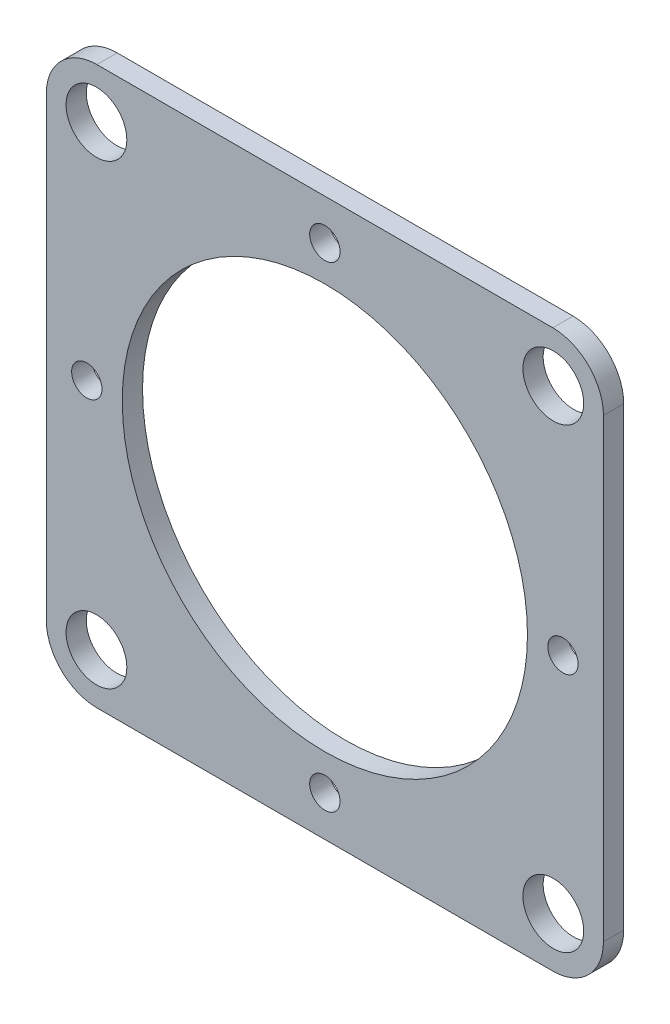
ISO-10303-21;
HEADER;
FILE_DESCRIPTION(('STEP AP214'),'2;1');
FILE_NAME('part.step','',(''),(''),'','','');
FILE_SCHEMA(('AUTOMOTIVE_DESIGN { 1 0 10303 214 1 1 1 1 }'));
ENDSEC;
DATA;
#1=APPLICATION_CONTEXT('core data for automotive mechanical design processes');
#2=APPLICATION_PROTOCOL_DEFINITION('international standard','automotive_design',2000,#1);
#3=PRODUCT_CONTEXT('',#1,'mechanical');
#4=PRODUCT('Part','Part','',(#3));
#5=PRODUCT_RELATED_PRODUCT_CATEGORY('part','',(#4));
#6=PRODUCT_DEFINITION_FORMATION('','',#4);
#7=PRODUCT_DEFINITION_CONTEXT('part definition',#1,'design');
#8=PRODUCT_DEFINITION('design','',#6,#7);
#9=PRODUCT_DEFINITION_SHAPE('','',#8);
#10=(LENGTH_UNIT() NAMED_UNIT(*) SI_UNIT(.MILLI.,.METRE.));
#11=(NAMED_UNIT(*) PLANE_ANGLE_UNIT() SI_UNIT($,.RADIAN.));
#12=(NAMED_UNIT(*) SI_UNIT($,.STERADIAN.) SOLID_ANGLE_UNIT());
#13=UNCERTAINTY_MEASURE_WITH_UNIT(LENGTH_MEASURE(1.E-05),#10,'distance_accuracy_value','');
#14=(GEOMETRIC_REPRESENTATION_CONTEXT(3) GLOBAL_UNCERTAINTY_ASSIGNED_CONTEXT((#13)) GLOBAL_UNIT_ASSIGNED_CONTEXT((#10,
#11,#12)) REPRESENTATION_CONTEXT('',''));
#15=CARTESIAN_POINT('',(0.,0.,0.));
#16=DIRECTION('',(0.,0.,1.));
#17=DIRECTION('',(1.,0.,0.));
#18=AXIS2_PLACEMENT_3D('',#15,#16,#17);
#19=CARTESIAN_POINT('',(0.,0.,2.));
#20=DIRECTION('',(0.,0.,1.));
#21=DIRECTION('',(1.,0.,0.));
#22=AXIS2_PLACEMENT_3D('',#19,#20,#21);
#23=PLANE('',#22);
#24=CARTESIAN_POINT('',(1.20606649667288E-12,-23.5,2.));
#25=DIRECTION('',(0.,0.,1.));
#26=DIRECTION('',(1.,0.,0.));
#27=AXIS2_PLACEMENT_3D('',#24,#25,#26);
#28=CIRCLE('',#27,1.5);
#29=CARTESIAN_POINT('',(1.50000000000121,-23.5,2.));
#30=VERTEX_POINT('',#29);
#31=EDGE_CURVE('E218',#30,#30,#28,.T.);
#32=ORIENTED_EDGE('',*,*,#31,.F.);
#33=EDGE_LOOP('',(#32));
#34=FACE_BOUND('',#33,.T.);
#35=CARTESIAN_POINT('',(-22.550252531693,-22.5502525316942,2.));
#36=DIRECTION('',(0.,0.,1.));
#37=DIRECTION('',(1.,0.,0.));
#38=AXIS2_PLACEMENT_3D('',#35,#36,#37);
#39=CIRCLE('',#38,3.);
#40=CARTESIAN_POINT('',(-19.550252531693,-22.5502525316942,2.));
#41=VERTEX_POINT('',#40);
#42=EDGE_CURVE('E206',#41,#41,#39,.T.);
#43=ORIENTED_EDGE('',*,*,#42,.F.);
#44=EDGE_LOOP('',(#43));
#45=FACE_BOUND('',#44,.T.);
#46=CARTESIAN_POINT('',(22.5502525316942,22.5502525316953,2.));
#47=DIRECTION('',(0.,0.,1.));
#48=DIRECTION('',(1.,0.,0.));
#49=AXIS2_PLACEMENT_3D('',#46,#47,#48);
#50=CIRCLE('',#49,2.99999999999999);
#51=CARTESIAN_POINT('',(25.5502525316942,22.5502525316953,2.));
#52=VERTEX_POINT('',#51);
#53=EDGE_CURVE('E194',#52,#52,#50,.T.);
#54=ORIENTED_EDGE('',*,*,#53,.F.);
#55=EDGE_LOOP('',(#54));
#56=FACE_BOUND('',#55,.T.);
#57=CARTESIAN_POINT('',(-22.5502525316942,22.5502525316942,2.));
#58=DIRECTION('',(0.,0.,1.));
#59=DIRECTION('',(1.,0.,0.));
#60=AXIS2_PLACEMENT_3D('',#57,#58,#59);
#61=CIRCLE('',#60,3.);
#62=CARTESIAN_POINT('',(-19.5502525316942,22.5502525316942,2.));
#63=VERTEX_POINT('',#62);
#64=EDGE_CURVE('E183',#63,#63,#61,.T.);
#65=ORIENTED_EDGE('',*,*,#64,.F.);
#66=EDGE_LOOP('',(#65));
#67=FACE_BOUND('',#66,.T.);
#68=DIRECTION('',(1.,0.,0.));
#69=VECTOR('',#68,1.);
#70=CARTESIAN_POINT('',(27.5,-27.5,2.));
#71=LINE('',#70,#69);
#72=CARTESIAN_POINT('',(-22.5,-27.5,2.));
#73=VERTEX_POINT('',#72);
#74=CARTESIAN_POINT('',(22.5,-27.5,2.));
#75=VERTEX_POINT('',#74);
#76=EDGE_CURVE('E168',#73,#75,#71,.T.);
#77=ORIENTED_EDGE('',*,*,#76,.T.);
#78=CARTESIAN_POINT('',(22.5,-22.5,2.));
#79=DIRECTION('',(0.,0.,1.));
#80=DIRECTION('',(1.,0.,0.));
#81=AXIS2_PLACEMENT_3D('',#78,#79,#80);
#82=CIRCLE('',#81,5.);
#83=CARTESIAN_POINT('',(27.5,-22.5,2.));
#84=VERTEX_POINT('',#83);
#85=EDGE_CURVE('E148',#75,#84,#82,.T.);
#86=ORIENTED_EDGE('',*,*,#85,.T.);
#87=DIRECTION('',(0.,1.,0.));
#88=VECTOR('',#87,1.);
#89=CARTESIAN_POINT('',(27.5,-27.5,2.));
#90=LINE('',#89,#88);
#91=CARTESIAN_POINT('',(27.5,22.5,2.));
#92=VERTEX_POINT('',#91);
#93=EDGE_CURVE('E118',#84,#92,#90,.T.);
#94=ORIENTED_EDGE('',*,*,#93,.T.);
#95=CARTESIAN_POINT('',(22.5,22.5,2.));
#96=DIRECTION('',(0.,0.,1.));
#97=DIRECTION('',(1.,0.,0.));
#98=AXIS2_PLACEMENT_3D('',#95,#96,#97);
#99=CIRCLE('',#98,5.);
#100=CARTESIAN_POINT('',(22.5,27.5,2.));
#101=VERTEX_POINT('',#100);
#102=EDGE_CURVE('E54',#92,#101,#99,.T.);
#103=ORIENTED_EDGE('',*,*,#102,.T.);
#104=DIRECTION('',(-1.,0.,0.));
#105=VECTOR('',#104,1.);
#106=CARTESIAN_POINT('',(27.5,27.5,2.));
#107=LINE('',#106,#105);
#108=CARTESIAN_POINT('',(-22.5,27.5,2.));
#109=VERTEX_POINT('',#108);
#110=EDGE_CURVE('E135',#101,#109,#107,.T.);
#111=ORIENTED_EDGE('',*,*,#110,.T.);
#112=CARTESIAN_POINT('',(-22.5,22.5,2.));
#113=DIRECTION('',(0.,0.,1.));
#114=DIRECTION('',(1.,0.,0.));
#115=AXIS2_PLACEMENT_3D('',#112,#113,#114);
#116=CIRCLE('',#115,5.);
#117=CARTESIAN_POINT('',(-27.5,22.5,2.));
#118=VERTEX_POINT('',#117);
#119=EDGE_CURVE('E143',#109,#118,#116,.T.);
#120=ORIENTED_EDGE('',*,*,#119,.T.);
#121=DIRECTION('',(0.,-1.,0.));
#122=VECTOR('',#121,1.);
#123=CARTESIAN_POINT('',(-27.5,-27.5,2.));
#124=LINE('',#123,#122);
#125=CARTESIAN_POINT('',(-27.5,-22.5,2.));
#126=VERTEX_POINT('',#125);
#127=EDGE_CURVE('E129',#118,#126,#124,.T.);
#128=ORIENTED_EDGE('',*,*,#127,.T.);
#129=CARTESIAN_POINT('',(-22.5,-22.5,2.));
#130=DIRECTION('',(0.,0.,1.));
#131=DIRECTION('',(1.,0.,0.));
#132=AXIS2_PLACEMENT_3D('',#129,#130,#131);
#133=CIRCLE('',#132,5.);
#134=EDGE_CURVE('E146',#126,#73,#133,.T.);
#135=ORIENTED_EDGE('',*,*,#134,.T.);
#136=EDGE_LOOP('',(#77,#86,#94,#103,#111,#120,#128,#135));
#137=FACE_BOUND('',#136,.T.);
#138=CARTESIAN_POINT('',(0.,0.,2.));
#139=DIRECTION('',(0.,0.,1.));
#140=DIRECTION('',(1.,0.,0.));
#141=AXIS2_PLACEMENT_3D('',#138,#139,#140);
#142=CIRCLE('',#141,20.);
#143=CARTESIAN_POINT('',(20.,0.,2.));
#144=VERTEX_POINT('',#143);
#145=EDGE_CURVE('E174',#144,#144,#142,.T.);
#146=ORIENTED_EDGE('',*,*,#145,.F.);
#147=EDGE_LOOP('',(#146));
#148=FACE_BOUND('',#147,.T.);
#149=CARTESIAN_POINT('',(0.,23.5,2.));
#150=DIRECTION('',(0.,0.,1.));
#151=DIRECTION('',(1.,0.,0.));
#152=AXIS2_PLACEMENT_3D('',#149,#150,#151);
#153=CIRCLE('',#152,1.5);
#154=CARTESIAN_POINT('',(1.49999999999999,23.5,2.));
#155=VERTEX_POINT('',#154);
#156=EDGE_CURVE('E188',#155,#155,#153,.T.);
#157=ORIENTED_EDGE('',*,*,#156,.F.);
#158=EDGE_LOOP('',(#157));
#159=FACE_BOUND('',#158,.T.);
#160=CARTESIAN_POINT('',(22.5502525316953,-22.5502525316931,2.));
#161=DIRECTION('',(0.,0.,1.));
#162=DIRECTION('',(1.,0.,0.));
#163=AXIS2_PLACEMENT_3D('',#160,#161,#162);
#164=CIRCLE('',#163,3.);
#165=CARTESIAN_POINT('',(25.5502525316953,-22.5502525316931,2.));
#166=VERTEX_POINT('',#165);
#167=EDGE_CURVE('E200',#166,#166,#164,.T.);
#168=ORIENTED_EDGE('',*,*,#167,.F.);
#169=EDGE_LOOP('',(#168));
#170=FACE_BOUND('',#169,.T.);
#171=CARTESIAN_POINT('',(23.5000000000006,6.06285854853894E-13,2.));
#172=DIRECTION('',(0.,0.,1.));
#173=DIRECTION('',(1.,0.,0.));
#174=AXIS2_PLACEMENT_3D('',#171,#172,#173);
#175=CIRCLE('',#174,1.5);
#176=CARTESIAN_POINT('',(25.0000000000006,6.06285854853894E-13,2.));
#177=VERTEX_POINT('',#176);
#178=EDGE_CURVE('E212',#177,#177,#175,.T.);
#179=ORIENTED_EDGE('',*,*,#178,.F.);
#180=EDGE_LOOP('',(#179));
#181=FACE_BOUND('',#180,.T.);
#182=CARTESIAN_POINT('',(-23.4999999999994,-6.09321620936853E-13,2.));
#183=DIRECTION('',(0.,0.,1.));
#184=DIRECTION('',(1.,0.,0.));
#185=AXIS2_PLACEMENT_3D('',#182,#183,#184);
#186=CIRCLE('',#185,1.5);
#187=CARTESIAN_POINT('',(-21.9999999999994,-6.09321620936853E-13,2.));
#188=VERTEX_POINT('',#187);
#189=EDGE_CURVE('E224',#188,#188,#186,.T.);
#190=ORIENTED_EDGE('',*,*,#189,.F.);
#191=EDGE_LOOP('',(#190));
#192=FACE_BOUND('',#191,.T.);
#193=ADVANCED_FACE('F33',(#34,#45,#56,#67,#137,#148,#159,#170,#181,#192),#23,.T.);
#194=CARTESIAN_POINT('',(0.,0.,0.));
#195=DIRECTION('',(0.,0.,1.));
#196=DIRECTION('',(1.,0.,0.));
#197=AXIS2_PLACEMENT_3D('',#194,#195,#196);
#198=PLANE('',#197);
#199=DIRECTION('',(0.,1.,0.));
#200=VECTOR('',#199,1.);
#201=CARTESIAN_POINT('',(27.5,-27.5,0.));
#202=LINE('',#201,#200);
#203=CARTESIAN_POINT('',(27.5,-22.5,0.));
#204=VERTEX_POINT('',#203);
#205=CARTESIAN_POINT('',(27.5,22.5,0.));
#206=VERTEX_POINT('',#205);
#207=EDGE_CURVE('E116',#204,#206,#202,.T.);
#208=ORIENTED_EDGE('',*,*,#207,.F.);
#209=CARTESIAN_POINT('',(22.5,-22.5,0.));
#210=DIRECTION('',(0.,0.,1.));
#211=DIRECTION('',(1.,0.,0.));
#212=AXIS2_PLACEMENT_3D('',#209,#210,#211);
#213=CIRCLE('',#212,5.);
#214=CARTESIAN_POINT('',(22.5,-27.5,0.));
#215=VERTEX_POINT('',#214);
#216=EDGE_CURVE('E99',#204,#215,#213,.F.);
#217=ORIENTED_EDGE('',*,*,#216,.T.);
#218=DIRECTION('',(1.,0.,0.));
#219=VECTOR('',#218,1.);
#220=CARTESIAN_POINT('',(27.5,-27.5,0.));
#221=LINE('',#220,#219);
#222=CARTESIAN_POINT('',(-22.5,-27.5,0.));
#223=VERTEX_POINT('',#222);
#224=EDGE_CURVE('E127',#223,#215,#221,.T.);
#225=ORIENTED_EDGE('',*,*,#224,.F.);
#226=CARTESIAN_POINT('',(-22.5,-22.5,0.));
#227=DIRECTION('',(0.,0.,1.));
#228=DIRECTION('',(1.,0.,0.));
#229=AXIS2_PLACEMENT_3D('',#226,#227,#228);
#230=CIRCLE('',#229,5.);
#231=CARTESIAN_POINT('',(-27.5,-22.5,0.));
#232=VERTEX_POINT('',#231);
#233=EDGE_CURVE('E110',#223,#232,#230,.F.);
#234=ORIENTED_EDGE('',*,*,#233,.T.);
#235=DIRECTION('',(0.,-1.,0.));
#236=VECTOR('',#235,1.);
#237=CARTESIAN_POINT('',(-27.5,-27.5,0.));
#238=LINE('',#237,#236);
#239=CARTESIAN_POINT('',(-27.5,22.5,0.));
#240=VERTEX_POINT('',#239);
#241=EDGE_CURVE('E131',#240,#232,#238,.T.);
#242=ORIENTED_EDGE('',*,*,#241,.F.);
#243=CARTESIAN_POINT('',(-22.5,22.5,0.));
#244=DIRECTION('',(0.,0.,1.));
#245=DIRECTION('',(1.,0.,0.));
#246=AXIS2_PLACEMENT_3D('',#243,#244,#245);
#247=CIRCLE('',#246,5.);
#248=CARTESIAN_POINT('',(-22.5,27.5,0.));
#249=VERTEX_POINT('',#248);
#250=EDGE_CURVE('E119',#240,#249,#247,.F.);
#251=ORIENTED_EDGE('',*,*,#250,.T.);
#252=DIRECTION('',(-1.,0.,0.));
#253=VECTOR('',#252,1.);
#254=CARTESIAN_POINT('',(27.5,27.5,0.));
#255=LINE('',#254,#253);
#256=CARTESIAN_POINT('',(22.5,27.5,0.));
#257=VERTEX_POINT('',#256);
#258=EDGE_CURVE('E126',#257,#249,#255,.T.);
#259=ORIENTED_EDGE('',*,*,#258,.F.);
#260=CARTESIAN_POINT('',(22.5,22.5,0.));
#261=DIRECTION('',(0.,0.,1.));
#262=DIRECTION('',(1.,0.,0.));
#263=AXIS2_PLACEMENT_3D('',#260,#261,#262);
#264=CIRCLE('',#263,5.);
#265=EDGE_CURVE('E125',#257,#206,#264,.F.);
#266=ORIENTED_EDGE('',*,*,#265,.T.);
#267=EDGE_LOOP('',(#208,#217,#225,#234,#242,#251,#259,#266));
#268=FACE_BOUND('',#267,.T.);
#269=CARTESIAN_POINT('',(0.,0.,0.));
#270=DIRECTION('',(0.,0.,1.));
#271=DIRECTION('',(1.,0.,0.));
#272=AXIS2_PLACEMENT_3D('',#269,#270,#271);
#273=CIRCLE('',#272,20.);
#274=CARTESIAN_POINT('',(20.,0.,0.));
#275=VERTEX_POINT('',#274);
#276=EDGE_CURVE('E176',#275,#275,#273,.T.);
#277=ORIENTED_EDGE('',*,*,#276,.T.);
#278=EDGE_LOOP('',(#277));
#279=FACE_BOUND('',#278,.T.);
#280=CARTESIAN_POINT('',(-22.5502525316942,22.5502525316942,0.));
#281=DIRECTION('',(0.,0.,1.));
#282=DIRECTION('',(1.,0.,0.));
#283=AXIS2_PLACEMENT_3D('',#280,#281,#282);
#284=CIRCLE('',#283,3.);
#285=CARTESIAN_POINT('',(-19.5502525316942,22.5502525316942,0.));
#286=VERTEX_POINT('',#285);
#287=EDGE_CURVE('E185',#286,#286,#284,.T.);
#288=ORIENTED_EDGE('',*,*,#287,.T.);
#289=EDGE_LOOP('',(#288));
#290=FACE_BOUND('',#289,.T.);
#291=CARTESIAN_POINT('',(0.,23.5,0.));
#292=DIRECTION('',(0.,0.,1.));
#293=DIRECTION('',(1.,0.,0.));
#294=AXIS2_PLACEMENT_3D('',#291,#292,#293);
#295=CIRCLE('',#294,1.5);
#296=CARTESIAN_POINT('',(1.49999999999999,23.5,0.));
#297=VERTEX_POINT('',#296);
#298=EDGE_CURVE('E191',#297,#297,#295,.T.);
#299=ORIENTED_EDGE('',*,*,#298,.T.);
#300=EDGE_LOOP('',(#299));
#301=FACE_BOUND('',#300,.T.);
#302=CARTESIAN_POINT('',(22.5502525316942,22.5502525316953,0.));
#303=DIRECTION('',(0.,0.,1.));
#304=DIRECTION('',(1.,0.,0.));
#305=AXIS2_PLACEMENT_3D('',#302,#303,#304);
#306=CIRCLE('',#305,2.99999999999999);
#307=CARTESIAN_POINT('',(25.5502525316942,22.5502525316953,0.));
#308=VERTEX_POINT('',#307);
#309=EDGE_CURVE('E197',#308,#308,#306,.T.);
#310=ORIENTED_EDGE('',*,*,#309,.T.);
#311=EDGE_LOOP('',(#310));
#312=FACE_BOUND('',#311,.T.);
#313=CARTESIAN_POINT('',(22.5502525316953,-22.5502525316931,0.));
#314=DIRECTION('',(0.,0.,1.));
#315=DIRECTION('',(1.,0.,0.));
#316=AXIS2_PLACEMENT_3D('',#313,#314,#315);
#317=CIRCLE('',#316,3.);
#318=CARTESIAN_POINT('',(25.5502525316953,-22.5502525316931,0.));
#319=VERTEX_POINT('',#318);
#320=EDGE_CURVE('E203',#319,#319,#317,.T.);
#321=ORIENTED_EDGE('',*,*,#320,.T.);
#322=EDGE_LOOP('',(#321));
#323=FACE_BOUND('',#322,.T.);
#324=CARTESIAN_POINT('',(-22.550252531693,-22.5502525316942,0.));
#325=DIRECTION('',(0.,0.,1.));
#326=DIRECTION('',(1.,0.,0.));
#327=AXIS2_PLACEMENT_3D('',#324,#325,#326);
#328=CIRCLE('',#327,3.);
#329=CARTESIAN_POINT('',(-19.550252531693,-22.5502525316942,0.));
#330=VERTEX_POINT('',#329);
#331=EDGE_CURVE('E209',#330,#330,#328,.T.);
#332=ORIENTED_EDGE('',*,*,#331,.T.);
#333=EDGE_LOOP('',(#332));
#334=FACE_BOUND('',#333,.T.);
#335=CARTESIAN_POINT('',(23.5000000000006,6.06285854853894E-13,0.));
#336=DIRECTION('',(0.,0.,1.));
#337=DIRECTION('',(1.,0.,0.));
#338=AXIS2_PLACEMENT_3D('',#335,#336,#337);
#339=CIRCLE('',#338,1.5);
#340=CARTESIAN_POINT('',(25.0000000000006,6.06285854853894E-13,0.));
#341=VERTEX_POINT('',#340);
#342=EDGE_CURVE('E215',#341,#341,#339,.T.);
#343=ORIENTED_EDGE('',*,*,#342,.T.);
#344=EDGE_LOOP('',(#343));
#345=FACE_BOUND('',#344,.T.);
#346=CARTESIAN_POINT('',(1.20606649667288E-12,-23.5,0.));
#347=DIRECTION('',(0.,0.,1.));
#348=DIRECTION('',(1.,0.,0.));
#349=AXIS2_PLACEMENT_3D('',#346,#347,#348);
#350=CIRCLE('',#349,1.5);
#351=CARTESIAN_POINT('',(1.50000000000121,-23.5,0.));
#352=VERTEX_POINT('',#351);
#353=EDGE_CURVE('E221',#352,#352,#350,.T.);
#354=ORIENTED_EDGE('',*,*,#353,.T.);
#355=EDGE_LOOP('',(#354));
#356=FACE_BOUND('',#355,.T.);
#357=CARTESIAN_POINT('',(-23.4999999999994,-6.09321620936853E-13,0.));
#358=DIRECTION('',(0.,0.,1.));
#359=DIRECTION('',(1.,0.,0.));
#360=AXIS2_PLACEMENT_3D('',#357,#358,#359);
#361=CIRCLE('',#360,1.5);
#362=CARTESIAN_POINT('',(-21.9999999999994,-6.09321620936853E-13,0.));
#363=VERTEX_POINT('',#362);
#364=EDGE_CURVE('E227',#363,#363,#361,.T.);
#365=ORIENTED_EDGE('',*,*,#364,.T.);
#366=EDGE_LOOP('',(#365));
#367=FACE_BOUND('',#366,.T.);
#368=ADVANCED_FACE('F122',(#268,#279,#290,#301,#312,#323,#334,#345,#356,#367),#198,.F.);
#369=CARTESIAN_POINT('',(-27.5,-27.5,2.));
#370=DIRECTION('',(1.,0.,0.));
#371=DIRECTION('',(0.,0.,-1.));
#372=AXIS2_PLACEMENT_3D('',#369,#370,#371);
#373=PLANE('',#372);
#374=ORIENTED_EDGE('',*,*,#241,.T.);
#375=DIRECTION('',(0.,0.,-1.));
#376=VECTOR('',#375,1.);
#377=CARTESIAN_POINT('',(-27.5,-22.5,2.));
#378=LINE('',#377,#376);
#379=EDGE_CURVE('E153',#232,#126,#378,.F.);
#380=ORIENTED_EDGE('',*,*,#379,.T.);
#381=ORIENTED_EDGE('',*,*,#127,.F.);
#382=DIRECTION('',(0.,0.,-1.));
#383=VECTOR('',#382,1.);
#384=CARTESIAN_POINT('',(-27.5,22.5,2.));
#385=LINE('',#384,#383);
#386=EDGE_CURVE('E150',#118,#240,#385,.T.);
#387=ORIENTED_EDGE('',*,*,#386,.T.);
#388=EDGE_LOOP('',(#374,#380,#381,#387));
#389=FACE_BOUND('',#388,.T.);
#390=ADVANCED_FACE('F159',(#389),#373,.F.);
#391=CARTESIAN_POINT('',(27.5,-27.5,2.));
#392=DIRECTION('',(0.,1.,0.));
#393=DIRECTION('',(-1.,0.,0.));
#394=AXIS2_PLACEMENT_3D('',#391,#392,#393);
#395=PLANE('',#394);
#396=ORIENTED_EDGE('',*,*,#224,.T.);
#397=DIRECTION('',(0.,0.,-1.));
#398=VECTOR('',#397,1.);
#399=CARTESIAN_POINT('',(22.5,-27.5,2.));
#400=LINE('',#399,#398);
#401=EDGE_CURVE('E104',#215,#75,#400,.F.);
#402=ORIENTED_EDGE('',*,*,#401,.T.);
#403=ORIENTED_EDGE('',*,*,#76,.F.);
#404=DIRECTION('',(0.,0.,-1.));
#405=VECTOR('',#404,1.);
#406=CARTESIAN_POINT('',(-22.5,-27.5,2.));
#407=LINE('',#406,#405);
#408=EDGE_CURVE('E109',#73,#223,#407,.T.);
#409=ORIENTED_EDGE('',*,*,#408,.T.);
#410=EDGE_LOOP('',(#396,#402,#403,#409));
#411=FACE_BOUND('',#410,.T.);
#412=ADVANCED_FACE('F173',(#411),#395,.F.);
#413=CARTESIAN_POINT('',(27.5,-27.5,2.));
#414=DIRECTION('',(-1.,0.,0.));
#415=DIRECTION('',(0.,0.,1.));
#416=AXIS2_PLACEMENT_3D('',#413,#414,#415);
#417=PLANE('',#416);
#418=ORIENTED_EDGE('',*,*,#93,.F.);
#419=DIRECTION('',(0.,0.,-1.));
#420=VECTOR('',#419,1.);
#421=CARTESIAN_POINT('',(27.5,-22.5,2.));
#422=LINE('',#421,#420);
#423=EDGE_CURVE('E103',#84,#204,#422,.T.);
#424=ORIENTED_EDGE('',*,*,#423,.T.);
#425=ORIENTED_EDGE('',*,*,#207,.T.);
#426=DIRECTION('',(0.,0.,-1.));
#427=VECTOR('',#426,1.);
#428=CARTESIAN_POINT('',(27.5,22.5,2.));
#429=LINE('',#428,#427);
#430=EDGE_CURVE('E120',#206,#92,#429,.F.);
#431=ORIENTED_EDGE('',*,*,#430,.T.);
#432=EDGE_LOOP('',(#418,#424,#425,#431));
#433=FACE_BOUND('',#432,.T.);
#434=ADVANCED_FACE('F115',(#433),#417,.F.);
#435=CARTESIAN_POINT('',(27.5,27.5,2.));
#436=DIRECTION('',(0.,-1.,0.));
#437=DIRECTION('',(1.,0.,0.));
#438=AXIS2_PLACEMENT_3D('',#435,#436,#437);
#439=PLANE('',#438);
#440=ORIENTED_EDGE('',*,*,#110,.F.);
#441=DIRECTION('',(0.,0.,-1.));
#442=VECTOR('',#441,1.);
#443=CARTESIAN_POINT('',(22.5,27.5,2.));
#444=LINE('',#443,#442);
#445=EDGE_CURVE('E11',#101,#257,#444,.T.);
#446=ORIENTED_EDGE('',*,*,#445,.T.);
#447=ORIENTED_EDGE('',*,*,#258,.T.);
#448=DIRECTION('',(0.,0.,-1.));
#449=VECTOR('',#448,1.);
#450=CARTESIAN_POINT('',(-22.5,27.5,2.));
#451=LINE('',#450,#449);
#452=EDGE_CURVE('E41',#249,#109,#451,.F.);
#453=ORIENTED_EDGE('',*,*,#452,.T.);
#454=EDGE_LOOP('',(#440,#446,#447,#453));
#455=FACE_BOUND('',#454,.T.);
#456=ADVANCED_FACE('F249',(#455),#439,.F.);
#457=CARTESIAN_POINT('',(0.,0.,2.));
#458=DIRECTION('',(0.,0.,-1.));
#459=DIRECTION('',(-1.,0.,0.));
#460=AXIS2_PLACEMENT_3D('',#457,#458,#459);
#461=CYLINDRICAL_SURFACE('',#460,20.);
#462=ORIENTED_EDGE('',*,*,#145,.T.);
#463=EDGE_LOOP('',(#462));
#464=FACE_BOUND('',#463,.T.);
#465=ORIENTED_EDGE('',*,*,#276,.F.);
#466=EDGE_LOOP('',(#465));
#467=FACE_BOUND('',#466,.T.);
#468=ADVANCED_FACE('F246',(#464,#467),#461,.F.);
#469=CARTESIAN_POINT('',(-22.5502525316942,22.5502525316942,2.));
#470=DIRECTION('',(0.,0.,-1.));
#471=DIRECTION('',(-1.,0.,0.));
#472=AXIS2_PLACEMENT_3D('',#469,#470,#471);
#473=CYLINDRICAL_SURFACE('',#472,3.);
#474=ORIENTED_EDGE('',*,*,#64,.T.);
#475=EDGE_LOOP('',(#474));
#476=FACE_BOUND('',#475,.T.);
#477=ORIENTED_EDGE('',*,*,#287,.F.);
#478=EDGE_LOOP('',(#477));
#479=FACE_BOUND('',#478,.T.);
#480=ADVANCED_FACE('F391',(#476,#479),#473,.F.);
#481=CARTESIAN_POINT('',(0.,23.5,2.));
#482=DIRECTION('',(0.,0.,-1.));
#483=DIRECTION('',(-1.,0.,0.));
#484=AXIS2_PLACEMENT_3D('',#481,#482,#483);
#485=CYLINDRICAL_SURFACE('',#484,1.5);
#486=ORIENTED_EDGE('',*,*,#156,.T.);
#487=EDGE_LOOP('',(#486));
#488=FACE_BOUND('',#487,.T.);
#489=ORIENTED_EDGE('',*,*,#298,.F.);
#490=EDGE_LOOP('',(#489));
#491=FACE_BOUND('',#490,.T.);
#492=ADVANCED_FACE('F381',(#488,#491),#485,.F.);
#493=CARTESIAN_POINT('',(22.5502525316942,22.5502525316953,2.));
#494=DIRECTION('',(0.,0.,-1.));
#495=DIRECTION('',(-1.,0.,0.));
#496=AXIS2_PLACEMENT_3D('',#493,#494,#495);
#497=CYLINDRICAL_SURFACE('',#496,2.99999999999999);
#498=ORIENTED_EDGE('',*,*,#53,.T.);
#499=EDGE_LOOP('',(#498));
#500=FACE_BOUND('',#499,.T.);
#501=ORIENTED_EDGE('',*,*,#309,.F.);
#502=EDGE_LOOP('',(#501));
#503=FACE_BOUND('',#502,.T.);
#504=ADVANCED_FACE('F371',(#500,#503),#497,.F.);
#505=CARTESIAN_POINT('',(22.5502525316953,-22.5502525316931,2.));
#506=DIRECTION('',(0.,0.,-1.));
#507=DIRECTION('',(-1.,0.,0.));
#508=AXIS2_PLACEMENT_3D('',#505,#506,#507);
#509=CYLINDRICAL_SURFACE('',#508,3.);
#510=ORIENTED_EDGE('',*,*,#167,.T.);
#511=EDGE_LOOP('',(#510));
#512=FACE_BOUND('',#511,.T.);
#513=ORIENTED_EDGE('',*,*,#320,.F.);
#514=EDGE_LOOP('',(#513));
#515=FACE_BOUND('',#514,.T.);
#516=ADVANCED_FACE('F361',(#512,#515),#509,.F.);
#517=CARTESIAN_POINT('',(-22.550252531693,-22.5502525316942,2.));
#518=DIRECTION('',(0.,0.,-1.));
#519=DIRECTION('',(-1.,0.,0.));
#520=AXIS2_PLACEMENT_3D('',#517,#518,#519);
#521=CYLINDRICAL_SURFACE('',#520,3.);
#522=ORIENTED_EDGE('',*,*,#42,.T.);
#523=EDGE_LOOP('',(#522));
#524=FACE_BOUND('',#523,.T.);
#525=ORIENTED_EDGE('',*,*,#331,.F.);
#526=EDGE_LOOP('',(#525));
#527=FACE_BOUND('',#526,.T.);
#528=ADVANCED_FACE('F351',(#524,#527),#521,.F.);
#529=CARTESIAN_POINT('',(23.5000000000006,6.06285854853894E-13,2.));
#530=DIRECTION('',(0.,0.,-1.));
#531=DIRECTION('',(-1.,0.,0.));
#532=AXIS2_PLACEMENT_3D('',#529,#530,#531);
#533=CYLINDRICAL_SURFACE('',#532,1.5);
#534=ORIENTED_EDGE('',*,*,#178,.T.);
#535=EDGE_LOOP('',(#534));
#536=FACE_BOUND('',#535,.T.);
#537=ORIENTED_EDGE('',*,*,#342,.F.);
#538=EDGE_LOOP('',(#537));
#539=FACE_BOUND('',#538,.T.);
#540=ADVANCED_FACE('F341',(#536,#539),#533,.F.);
#541=CARTESIAN_POINT('',(1.20606649667288E-12,-23.5,2.));
#542=DIRECTION('',(0.,0.,-1.));
#543=DIRECTION('',(-1.,0.,0.));
#544=AXIS2_PLACEMENT_3D('',#541,#542,#543);
#545=CYLINDRICAL_SURFACE('',#544,1.5);
#546=ORIENTED_EDGE('',*,*,#31,.T.);
#547=EDGE_LOOP('',(#546));
#548=FACE_BOUND('',#547,.T.);
#549=ORIENTED_EDGE('',*,*,#353,.F.);
#550=EDGE_LOOP('',(#549));
#551=FACE_BOUND('',#550,.T.);
#552=ADVANCED_FACE('F332',(#548,#551),#545,.F.);
#553=CARTESIAN_POINT('',(-23.4999999999994,-6.09321620936853E-13,2.));
#554=DIRECTION('',(0.,0.,-1.));
#555=DIRECTION('',(-1.,0.,0.));
#556=AXIS2_PLACEMENT_3D('',#553,#554,#555);
#557=CYLINDRICAL_SURFACE('',#556,1.5);
#558=ORIENTED_EDGE('',*,*,#189,.T.);
#559=EDGE_LOOP('',(#558));
#560=FACE_BOUND('',#559,.T.);
#561=ORIENTED_EDGE('',*,*,#364,.F.);
#562=EDGE_LOOP('',(#561));
#563=FACE_BOUND('',#562,.T.);
#564=ADVANCED_FACE('F233',(#560,#563),#557,.F.);
#565=CARTESIAN_POINT('',(22.5,-22.5,2.));
#566=DIRECTION('',(0.,0.,-1.));
#567=DIRECTION('',(-1.,0.,0.));
#568=AXIS2_PLACEMENT_3D('',#565,#566,#567);
#569=CYLINDRICAL_SURFACE('',#568,5.);
#570=ORIENTED_EDGE('',*,*,#85,.F.);
#571=ORIENTED_EDGE('',*,*,#401,.F.);
#572=ORIENTED_EDGE('',*,*,#216,.F.);
#573=ORIENTED_EDGE('',*,*,#423,.F.);
#574=EDGE_LOOP('',(#570,#571,#572,#573));
#575=FACE_BOUND('',#574,.T.);
#576=ADVANCED_FACE('F102',(#575),#569,.T.);
#577=CARTESIAN_POINT('',(-22.5,-22.5,2.));
#578=DIRECTION('',(0.,0.,-1.));
#579=DIRECTION('',(-1.,0.,0.));
#580=AXIS2_PLACEMENT_3D('',#577,#578,#579);
#581=CYLINDRICAL_SURFACE('',#580,5.);
#582=ORIENTED_EDGE('',*,*,#134,.F.);
#583=ORIENTED_EDGE('',*,*,#379,.F.);
#584=ORIENTED_EDGE('',*,*,#233,.F.);
#585=ORIENTED_EDGE('',*,*,#408,.F.);
#586=EDGE_LOOP('',(#582,#583,#584,#585));
#587=FACE_BOUND('',#586,.T.);
#588=ADVANCED_FACE('F171',(#587),#581,.T.);
#589=CARTESIAN_POINT('',(22.5,22.5,2.));
#590=DIRECTION('',(0.,0.,-1.));
#591=DIRECTION('',(-1.,0.,0.));
#592=AXIS2_PLACEMENT_3D('',#589,#590,#591);
#593=CYLINDRICAL_SURFACE('',#592,5.);
#594=ORIENTED_EDGE('',*,*,#102,.F.);
#595=ORIENTED_EDGE('',*,*,#430,.F.);
#596=ORIENTED_EDGE('',*,*,#265,.F.);
#597=ORIENTED_EDGE('',*,*,#445,.F.);
#598=EDGE_LOOP('',(#594,#595,#596,#597));
#599=FACE_BOUND('',#598,.T.);
#600=ADVANCED_FACE('F261',(#599),#593,.T.);
#601=CARTESIAN_POINT('',(-22.5,22.5,2.));
#602=DIRECTION('',(0.,0.,-1.));
#603=DIRECTION('',(-1.,0.,0.));
#604=AXIS2_PLACEMENT_3D('',#601,#602,#603);
#605=CYLINDRICAL_SURFACE('',#604,5.);
#606=ORIENTED_EDGE('',*,*,#119,.F.);
#607=ORIENTED_EDGE('',*,*,#452,.F.);
#608=ORIENTED_EDGE('',*,*,#250,.F.);
#609=ORIENTED_EDGE('',*,*,#386,.F.);
#610=EDGE_LOOP('',(#606,#607,#608,#609));
#611=FACE_BOUND('',#610,.T.);
#612=ADVANCED_FACE('F35',(#611),#605,.T.);
#613=CLOSED_SHELL('',(#193,#368,#390,#412,#434,#456,#468,#480,#492,#504,#516,#528,#540,#552,
#564,#576,#588,#600,#612));
#614=MANIFOLD_SOLID_BREP('B2',#613);
#615=ADVANCED_BREP_SHAPE_REPRESENTATION('',(#18,#614),#14);
#616=SHAPE_DEFINITION_REPRESENTATION(#9,#615);
ENDSEC;
END-ISO-10303-21;
